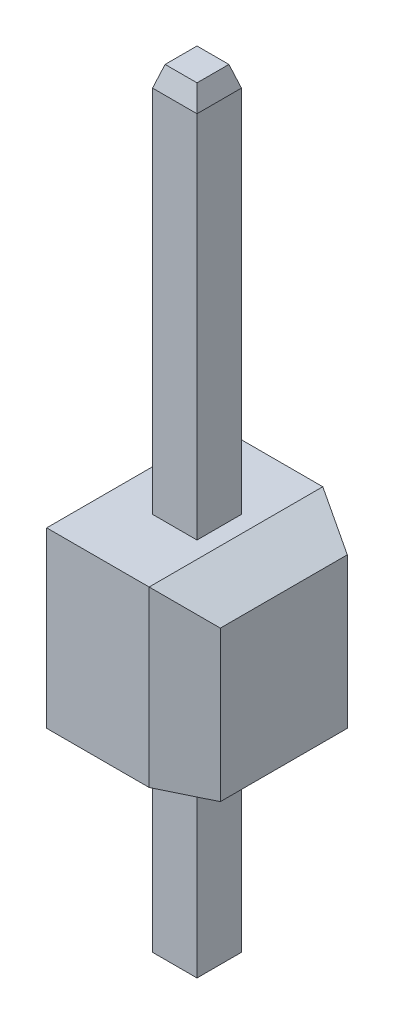
ISO-10303-21;
HEADER;
FILE_DESCRIPTION(('STEP AP214'),'2;1');
FILE_NAME('part.step','',(''),(''),'','','');
FILE_SCHEMA(('AUTOMOTIVE_DESIGN { 1 0 10303 214 1 1 1 1 }'));
ENDSEC;
DATA;
#1=APPLICATION_CONTEXT('core data for automotive mechanical design processes');
#2=APPLICATION_PROTOCOL_DEFINITION('international standard','automotive_design',2000,#1);
#3=PRODUCT_CONTEXT('',#1,'mechanical');
#4=PRODUCT('Part','Part','',(#3));
#5=PRODUCT_RELATED_PRODUCT_CATEGORY('part','',(#4));
#6=PRODUCT_DEFINITION_FORMATION('','',#4);
#7=PRODUCT_DEFINITION_CONTEXT('part definition',#1,'design');
#8=PRODUCT_DEFINITION('design','',#6,#7);
#9=PRODUCT_DEFINITION_SHAPE('','',#8);
#10=(LENGTH_UNIT() NAMED_UNIT(*) SI_UNIT(.MILLI.,.METRE.));
#11=(NAMED_UNIT(*) PLANE_ANGLE_UNIT() SI_UNIT($,.RADIAN.));
#12=(NAMED_UNIT(*) SI_UNIT($,.STERADIAN.) SOLID_ANGLE_UNIT());
#13=UNCERTAINTY_MEASURE_WITH_UNIT(LENGTH_MEASURE(1.E-05),#10,'distance_accuracy_value','');
#14=(GEOMETRIC_REPRESENTATION_CONTEXT(3) GLOBAL_UNCERTAINTY_ASSIGNED_CONTEXT((#13)) GLOBAL_UNIT_ASSIGNED_CONTEXT((#10,
#11,#12)) REPRESENTATION_CONTEXT('',''));
#15=CARTESIAN_POINT('',(0.,0.,0.));
#16=DIRECTION('',(0.,0.,1.));
#17=DIRECTION('',(1.,0.,0.));
#18=AXIS2_PLACEMENT_3D('',#15,#16,#17);
#19=CARTESIAN_POINT('',(-1.27,0.,1.27));
#20=DIRECTION('',(0.,-1.,0.));
#21=DIRECTION('',(0.,0.,-1.));
#22=AXIS2_PLACEMENT_3D('',#19,#20,#21);
#23=PLANE('',#22);
#24=DIRECTION('',(0.,0.,-1.));
#25=VECTOR('',#24,1.);
#26=CARTESIAN_POINT('',(1.27,0.,1.27));
#27=LINE('',#26,#25);
#28=CARTESIAN_POINT('',(1.27,0.,0.928587188003895));
#29=VERTEX_POINT('',#28);
#30=CARTESIAN_POINT('',(1.27,0.,-0.928587188003895));
#31=VERTEX_POINT('',#30);
#32=EDGE_CURVE('E222',#29,#31,#27,.T.);
#33=ORIENTED_EDGE('',*,*,#32,.F.);
#34=DIRECTION('',(0.89879404629917,0.,-0.438371146789072));
#35=VECTOR('',#34,1.);
#36=CARTESIAN_POINT('',(-0.916408557299617,0.,1.99496989331817));
#37=LINE('',#36,#35);
#38=CARTESIAN_POINT('',(0.569999999999985,0.,1.27));
#39=VERTEX_POINT('',#38);
#40=EDGE_CURVE('E308',#29,#39,#37,.F.);
#41=ORIENTED_EDGE('',*,*,#40,.T.);
#42=DIRECTION('',(1.,0.,0.));
#43=VECTOR('',#42,1.);
#44=CARTESIAN_POINT('',(-1.27,0.,1.27));
#45=LINE('',#44,#43);
#46=CARTESIAN_POINT('',(-0.928587188003896,0.,1.27));
#47=VERTEX_POINT('',#46);
#48=EDGE_CURVE('E226',#47,#39,#45,.T.);
#49=ORIENTED_EDGE('',*,*,#48,.F.);
#50=DIRECTION('',(-0.438371146789073,0.,-0.898794046299169));
#51=VECTOR('',#50,1.);
#52=CARTESIAN_POINT('',(-0.994196236237645,0.,1.13548151636398));
#53=LINE('',#52,#51);
#54=CARTESIAN_POINT('',(-1.27,0.,0.569999999999989));
#55=VERTEX_POINT('',#54);
#56=EDGE_CURVE('E304',#47,#55,#53,.T.);
#57=ORIENTED_EDGE('',*,*,#56,.T.);
#58=DIRECTION('',(0.,0.,-1.));
#59=VECTOR('',#58,1.);
#60=CARTESIAN_POINT('',(-1.27,0.,1.27));
#61=LINE('',#60,#59);
#62=CARTESIAN_POINT('',(-1.27,0.,-0.569999999999988));
#63=VERTEX_POINT('',#62);
#64=EDGE_CURVE('E223',#55,#63,#61,.T.);
#65=ORIENTED_EDGE('',*,*,#64,.T.);
#66=DIRECTION('',(0.438371146789073,0.,-0.898794046299169));
#67=VECTOR('',#66,1.);
#68=CARTESIAN_POINT('',(-1.99496989331817,0.,0.916408557299615));
#69=LINE('',#68,#67);
#70=CARTESIAN_POINT('',(-0.928587188003896,0.,-1.27));
#71=VERTEX_POINT('',#70);
#72=EDGE_CURVE('E302',#63,#71,#69,.T.);
#73=ORIENTED_EDGE('',*,*,#72,.T.);
#74=DIRECTION('',(1.,0.,0.));
#75=VECTOR('',#74,1.);
#76=CARTESIAN_POINT('',(-1.27,0.,-1.27));
#77=LINE('',#76,#75);
#78=CARTESIAN_POINT('',(0.569999999999985,0.,-1.27));
#79=VERTEX_POINT('',#78);
#80=EDGE_CURVE('E236',#71,#79,#77,.T.);
#81=ORIENTED_EDGE('',*,*,#80,.T.);
#82=DIRECTION('',(-0.89879404629917,0.,-0.438371146789072));
#83=VECTOR('',#82,1.);
#84=CARTESIAN_POINT('',(0.0843650997809104,0.,-1.50685996698177));
#85=LINE('',#84,#83);
#86=EDGE_CURVE('E306',#79,#31,#85,.F.);
#87=ORIENTED_EDGE('',*,*,#86,.T.);
#88=EDGE_LOOP('',(#33,#41,#49,#57,#65,#73,#81,#87));
#89=FACE_BOUND('',#88,.T.);
#90=DIRECTION('',(0.,0.,1.));
#91=VECTOR('',#90,1.);
#92=CARTESIAN_POINT('',(0.325,0.,0.325));
#93=LINE('',#92,#91);
#94=CARTESIAN_POINT('',(0.325,0.,-0.325));
#95=VERTEX_POINT('',#94);
#96=CARTESIAN_POINT('',(0.325,0.,0.325));
#97=VERTEX_POINT('',#96);
#98=EDGE_CURVE('E173',#95,#97,#93,.T.);
#99=ORIENTED_EDGE('',*,*,#98,.F.);
#100=DIRECTION('',(1.,0.,0.));
#101=VECTOR('',#100,1.);
#102=CARTESIAN_POINT('',(0.325,0.,-0.325));
#103=LINE('',#102,#101);
#104=CARTESIAN_POINT('',(-0.325,0.,-0.325));
#105=VERTEX_POINT('',#104);
#106=EDGE_CURVE('E183',#105,#95,#103,.T.);
#107=ORIENTED_EDGE('',*,*,#106,.F.);
#108=DIRECTION('',(0.,0.,-1.));
#109=VECTOR('',#108,1.);
#110=CARTESIAN_POINT('',(-0.325,0.,-0.325));
#111=LINE('',#110,#109);
#112=CARTESIAN_POINT('',(-0.325,0.,0.325));
#113=VERTEX_POINT('',#112);
#114=EDGE_CURVE('E195',#113,#105,#111,.T.);
#115=ORIENTED_EDGE('',*,*,#114,.F.);
#116=DIRECTION('',(-1.,0.,0.));
#117=VECTOR('',#116,1.);
#118=CARTESIAN_POINT('',(-0.325,0.,0.325));
#119=LINE('',#118,#117);
#120=EDGE_CURVE('E193',#97,#113,#119,.T.);
#121=ORIENTED_EDGE('',*,*,#120,.F.);
#122=EDGE_LOOP('',(#99,#107,#115,#121));
#123=FACE_BOUND('',#122,.T.);
#124=ADVANCED_FACE('F33',(#89,#123),#23,.T.);
#125=CARTESIAN_POINT('',(-1.27,2.54,-1.27));
#126=DIRECTION('',(0.,1.,0.));
#127=DIRECTION('',(0.,0.,1.));
#128=AXIS2_PLACEMENT_3D('',#125,#126,#127);
#129=PLANE('',#128);
#130=DIRECTION('',(1.,0.,0.));
#131=VECTOR('',#130,1.);
#132=CARTESIAN_POINT('',(-1.27,2.54,1.27));
#133=LINE('',#132,#131);
#134=CARTESIAN_POINT('',(-0.928587188003896,2.54,1.27));
#135=VERTEX_POINT('',#134);
#136=CARTESIAN_POINT('',(0.569999999999985,2.54,1.27));
#137=VERTEX_POINT('',#136);
#138=EDGE_CURVE('E229',#135,#137,#133,.T.);
#139=ORIENTED_EDGE('',*,*,#138,.T.);
#140=DIRECTION('',(0.,0.,-1.));
#141=VECTOR('',#140,1.);
#142=CARTESIAN_POINT('',(0.569999999999985,2.54,-1.27));
#143=LINE('',#142,#141);
#144=CARTESIAN_POINT('',(0.569999999999985,2.54,-1.27));
#145=VERTEX_POINT('',#144);
#146=EDGE_CURVE('E321',#137,#145,#143,.T.);
#147=ORIENTED_EDGE('',*,*,#146,.T.);
#148=DIRECTION('',(1.,0.,0.));
#149=VECTOR('',#148,1.);
#150=CARTESIAN_POINT('',(-1.27,2.54,-1.27));
#151=LINE('',#150,#149);
#152=CARTESIAN_POINT('',(-0.928587188003896,2.54,-1.27));
#153=VERTEX_POINT('',#152);
#154=EDGE_CURVE('E233',#153,#145,#151,.T.);
#155=ORIENTED_EDGE('',*,*,#154,.F.);
#156=DIRECTION('',(0.,0.,1.));
#157=VECTOR('',#156,1.);
#158=CARTESIAN_POINT('',(-0.928587188003896,2.54,1.27));
#159=LINE('',#158,#157);
#160=EDGE_CURVE('E319',#153,#135,#159,.T.);
#161=ORIENTED_EDGE('',*,*,#160,.T.);
#162=EDGE_LOOP('',(#139,#147,#155,#161));
#163=FACE_BOUND('',#162,.T.);
#164=DIRECTION('',(-1.,0.,0.));
#165=VECTOR('',#164,1.);
#166=CARTESIAN_POINT('',(-0.325,2.54,-0.325));
#167=LINE('',#166,#165);
#168=CARTESIAN_POINT('',(0.325,2.54,-0.325));
#169=VERTEX_POINT('',#168);
#170=CARTESIAN_POINT('',(-0.325,2.54,-0.325));
#171=VERTEX_POINT('',#170);
#172=EDGE_CURVE('E205',#169,#171,#167,.T.);
#173=ORIENTED_EDGE('',*,*,#172,.F.);
#174=DIRECTION('',(0.,0.,-1.));
#175=VECTOR('',#174,1.);
#176=CARTESIAN_POINT('',(0.325,2.54,-0.325));
#177=LINE('',#176,#175);
#178=CARTESIAN_POINT('',(0.325,2.54,0.325));
#179=VERTEX_POINT('',#178);
#180=EDGE_CURVE('E179',#179,#169,#177,.T.);
#181=ORIENTED_EDGE('',*,*,#180,.F.);
#182=DIRECTION('',(1.,0.,0.));
#183=VECTOR('',#182,1.);
#184=CARTESIAN_POINT('',(0.325,2.54,0.325));
#185=LINE('',#184,#183);
#186=CARTESIAN_POINT('',(-0.325,2.54,0.325));
#187=VERTEX_POINT('',#186);
#188=EDGE_CURVE('E211',#187,#179,#185,.T.);
#189=ORIENTED_EDGE('',*,*,#188,.F.);
#190=DIRECTION('',(0.,0.,1.));
#191=VECTOR('',#190,1.);
#192=CARTESIAN_POINT('',(-0.325,2.54,0.325));
#193=LINE('',#192,#191);
#194=EDGE_CURVE('E208',#171,#187,#193,.T.);
#195=ORIENTED_EDGE('',*,*,#194,.F.);
#196=EDGE_LOOP('',(#173,#181,#189,#195));
#197=FACE_BOUND('',#196,.T.);
#198=ADVANCED_FACE('F355',(#163,#197),#129,.T.);
#199=CARTESIAN_POINT('',(-1.27,2.54,1.27));
#200=DIRECTION('',(0.,0.,1.));
#201=DIRECTION('',(1.,0.,0.));
#202=AXIS2_PLACEMENT_3D('',#199,#200,#201);
#203=PLANE('',#202);
#204=ORIENTED_EDGE('',*,*,#48,.T.);
#205=DIRECTION('',(0.,1.,0.));
#206=VECTOR('',#205,1.);
#207=CARTESIAN_POINT('',(0.569999999999985,2.54,1.27));
#208=LINE('',#207,#206);
#209=EDGE_CURVE('E313',#39,#137,#208,.T.);
#210=ORIENTED_EDGE('',*,*,#209,.T.);
#211=ORIENTED_EDGE('',*,*,#138,.F.);
#212=DIRECTION('',(0.,-1.,0.));
#213=VECTOR('',#212,1.);
#214=CARTESIAN_POINT('',(-0.928587188003896,0.,1.27));
#215=LINE('',#214,#213);
#216=EDGE_CURVE('E310',#135,#47,#215,.T.);
#217=ORIENTED_EDGE('',*,*,#216,.T.);
#218=EDGE_LOOP('',(#204,#210,#211,#217));
#219=FACE_BOUND('',#218,.T.);
#220=ADVANCED_FACE('F351',(#219),#203,.T.);
#221=CARTESIAN_POINT('',(-1.27,0.,-1.27));
#222=DIRECTION('',(0.,0.,-1.));
#223=DIRECTION('',(-1.,0.,0.));
#224=AXIS2_PLACEMENT_3D('',#221,#222,#223);
#225=PLANE('',#224);
#226=ORIENTED_EDGE('',*,*,#154,.T.);
#227=DIRECTION('',(0.,-1.,0.));
#228=VECTOR('',#227,1.);
#229=CARTESIAN_POINT('',(0.569999999999985,0.,-1.27));
#230=LINE('',#229,#228);
#231=EDGE_CURVE('E317',#145,#79,#230,.T.);
#232=ORIENTED_EDGE('',*,*,#231,.T.);
#233=ORIENTED_EDGE('',*,*,#80,.F.);
#234=DIRECTION('',(0.,1.,0.));
#235=VECTOR('',#234,1.);
#236=CARTESIAN_POINT('',(-0.928587188003896,2.54,-1.27));
#237=LINE('',#236,#235);
#238=EDGE_CURVE('E315',#71,#153,#237,.T.);
#239=ORIENTED_EDGE('',*,*,#238,.T.);
#240=EDGE_LOOP('',(#226,#232,#233,#239));
#241=FACE_BOUND('',#240,.T.);
#242=ADVANCED_FACE('F374',(#241),#225,.T.);
#243=CARTESIAN_POINT('',(-1.27,0.,0.));
#244=DIRECTION('',(1.,0.,0.));
#245=DIRECTION('',(0.,0.,-1.));
#246=AXIS2_PLACEMENT_3D('',#243,#244,#245);
#247=PLANE('',#246);
#248=ORIENTED_EDGE('',*,*,#64,.F.);
#249=DIRECTION('',(0.,1.,0.));
#250=VECTOR('',#249,1.);
#251=CARTESIAN_POINT('',(-1.27,2.54,0.569999999999989));
#252=LINE('',#251,#250);
#253=CARTESIAN_POINT('',(-1.27,1.83999999999999,0.569999999999989));
#254=VERTEX_POINT('',#253);
#255=EDGE_CURVE('E11',#55,#254,#252,.T.);
#256=ORIENTED_EDGE('',*,*,#255,.T.);
#257=DIRECTION('',(0.,0.,-1.));
#258=VECTOR('',#257,1.);
#259=CARTESIAN_POINT('',(-1.27,1.83999999999999,-1.27));
#260=LINE('',#259,#258);
#261=CARTESIAN_POINT('',(-1.27,1.83999999999999,-0.569999999999989));
#262=VERTEX_POINT('',#261);
#263=EDGE_CURVE('E42',#254,#262,#260,.T.);
#264=ORIENTED_EDGE('',*,*,#263,.T.);
#265=DIRECTION('',(0.,-1.,0.));
#266=VECTOR('',#265,1.);
#267=CARTESIAN_POINT('',(-1.27,0.,-0.569999999999989));
#268=LINE('',#267,#266);
#269=EDGE_CURVE('E323',#262,#63,#268,.T.);
#270=ORIENTED_EDGE('',*,*,#269,.T.);
#271=EDGE_LOOP('',(#248,#256,#264,#270));
#272=FACE_BOUND('',#271,.T.);
#273=ADVANCED_FACE('F343',(#272),#247,.F.);
#274=CARTESIAN_POINT('',(1.27,0.,0.));
#275=DIRECTION('',(1.,0.,0.));
#276=DIRECTION('',(0.,0.,-1.));
#277=AXIS2_PLACEMENT_3D('',#274,#275,#276);
#278=PLANE('',#277);
#279=DIRECTION('',(0.,0.,1.));
#280=VECTOR('',#279,1.);
#281=CARTESIAN_POINT('',(1.27,2.19858718800389,0.));
#282=LINE('',#281,#280);
#283=CARTESIAN_POINT('',(1.27,2.19858718800389,-0.928587188003895));
#284=VERTEX_POINT('',#283);
#285=CARTESIAN_POINT('',(1.27,2.19858718800389,0.928587188003895));
#286=VERTEX_POINT('',#285);
#287=EDGE_CURVE('E285',#284,#286,#282,.T.);
#288=ORIENTED_EDGE('',*,*,#287,.T.);
#289=DIRECTION('',(0.,-1.,0.));
#290=VECTOR('',#289,1.);
#291=CARTESIAN_POINT('',(1.27,0.,0.928587188003895));
#292=LINE('',#291,#290);
#293=EDGE_CURVE('E299',#286,#29,#292,.T.);
#294=ORIENTED_EDGE('',*,*,#293,.T.);
#295=ORIENTED_EDGE('',*,*,#32,.T.);
#296=DIRECTION('',(0.,1.,0.));
#297=VECTOR('',#296,1.);
#298=CARTESIAN_POINT('',(1.27,0.,-0.928587188003895));
#299=LINE('',#298,#297);
#300=EDGE_CURVE('E297',#31,#284,#299,.T.);
#301=ORIENTED_EDGE('',*,*,#300,.T.);
#302=EDGE_LOOP('',(#288,#294,#295,#301));
#303=FACE_BOUND('',#302,.T.);
#304=ADVANCED_FACE('F367',(#303),#278,.T.);
#305=CARTESIAN_POINT('',(0.325,8.24,-0.325));
#306=DIRECTION('',(-1.,0.,0.));
#307=DIRECTION('',(0.,0.,1.));
#308=AXIS2_PLACEMENT_3D('',#305,#306,#307);
#309=PLANE('',#308);
#310=DIRECTION('',(0.,-1.,0.));
#311=VECTOR('',#310,1.);
#312=CARTESIAN_POINT('',(0.325,8.24,-0.325));
#313=LINE('',#312,#311);
#314=CARTESIAN_POINT('',(0.325,7.94,-0.325));
#315=VERTEX_POINT('',#314);
#316=EDGE_CURVE('E220',#315,#169,#313,.T.);
#317=ORIENTED_EDGE('',*,*,#316,.F.);
#318=DIRECTION('',(0.,0.,1.));
#319=VECTOR('',#318,1.);
#320=CARTESIAN_POINT('',(0.325,7.94,-0.325));
#321=LINE('',#320,#319);
#322=CARTESIAN_POINT('',(0.325,7.94,0.325));
#323=VERTEX_POINT('',#322);
#324=EDGE_CURVE('E256',#315,#323,#321,.T.);
#325=ORIENTED_EDGE('',*,*,#324,.T.);
#326=DIRECTION('',(0.,-1.,0.));
#327=VECTOR('',#326,1.);
#328=CARTESIAN_POINT('',(0.325,8.24,0.325));
#329=LINE('',#328,#327);
#330=EDGE_CURVE('E214',#323,#179,#329,.T.);
#331=ORIENTED_EDGE('',*,*,#330,.T.);
#332=ORIENTED_EDGE('',*,*,#180,.T.);
#333=EDGE_LOOP('',(#317,#325,#331,#332));
#334=FACE_BOUND('',#333,.T.);
#335=ADVANCED_FACE('F547',(#334),#309,.F.);
#336=CARTESIAN_POINT('',(-0.325,8.24,-0.325));
#337=DIRECTION('',(0.,0.,1.));
#338=DIRECTION('',(1.,0.,0.));
#339=AXIS2_PLACEMENT_3D('',#336,#337,#338);
#340=PLANE('',#339);
#341=DIRECTION('',(0.,-1.,0.));
#342=VECTOR('',#341,1.);
#343=CARTESIAN_POINT('',(-0.325,8.24,-0.325));
#344=LINE('',#343,#342);
#345=CARTESIAN_POINT('',(-0.325,7.94,-0.325));
#346=VERTEX_POINT('',#345);
#347=EDGE_CURVE('E218',#346,#171,#344,.T.);
#348=ORIENTED_EDGE('',*,*,#347,.F.);
#349=DIRECTION('',(1.,0.,0.));
#350=VECTOR('',#349,1.);
#351=CARTESIAN_POINT('',(-0.325,7.94,-0.325));
#352=LINE('',#351,#350);
#353=EDGE_CURVE('E254',#346,#315,#352,.T.);
#354=ORIENTED_EDGE('',*,*,#353,.T.);
#355=ORIENTED_EDGE('',*,*,#316,.T.);
#356=ORIENTED_EDGE('',*,*,#172,.T.);
#357=EDGE_LOOP('',(#348,#354,#355,#356));
#358=FACE_BOUND('',#357,.T.);
#359=ADVANCED_FACE('F539',(#358),#340,.F.);
#360=CARTESIAN_POINT('',(-0.325,8.24,0.325));
#361=DIRECTION('',(1.,0.,0.));
#362=DIRECTION('',(0.,0.,-1.));
#363=AXIS2_PLACEMENT_3D('',#360,#361,#362);
#364=PLANE('',#363);
#365=DIRECTION('',(0.,-1.,0.));
#366=VECTOR('',#365,1.);
#367=CARTESIAN_POINT('',(-0.325,8.24,0.325));
#368=LINE('',#367,#366);
#369=CARTESIAN_POINT('',(-0.325,7.94,0.325));
#370=VERTEX_POINT('',#369);
#371=EDGE_CURVE('E216',#370,#187,#368,.T.);
#372=ORIENTED_EDGE('',*,*,#371,.F.);
#373=DIRECTION('',(0.,0.,-1.));
#374=VECTOR('',#373,1.);
#375=CARTESIAN_POINT('',(-0.325,7.94,0.325));
#376=LINE('',#375,#374);
#377=EDGE_CURVE('E249',#370,#346,#376,.T.);
#378=ORIENTED_EDGE('',*,*,#377,.T.);
#379=ORIENTED_EDGE('',*,*,#347,.T.);
#380=ORIENTED_EDGE('',*,*,#194,.T.);
#381=EDGE_LOOP('',(#372,#378,#379,#380));
#382=FACE_BOUND('',#381,.T.);
#383=ADVANCED_FACE('F531',(#382),#364,.F.);
#384=CARTESIAN_POINT('',(0.325,8.24,0.325));
#385=DIRECTION('',(0.,0.,-1.));
#386=DIRECTION('',(-1.,0.,0.));
#387=AXIS2_PLACEMENT_3D('',#384,#385,#386);
#388=PLANE('',#387);
#389=ORIENTED_EDGE('',*,*,#330,.F.);
#390=DIRECTION('',(-1.,0.,0.));
#391=VECTOR('',#390,1.);
#392=CARTESIAN_POINT('',(0.325,7.94,0.325));
#393=LINE('',#392,#391);
#394=EDGE_CURVE('E252',#323,#370,#393,.T.);
#395=ORIENTED_EDGE('',*,*,#394,.T.);
#396=ORIENTED_EDGE('',*,*,#371,.T.);
#397=ORIENTED_EDGE('',*,*,#188,.T.);
#398=EDGE_LOOP('',(#389,#395,#396,#397));
#399=FACE_BOUND('',#398,.T.);
#400=ADVANCED_FACE('F523',(#399),#388,.F.);
#401=CARTESIAN_POINT('',(0.,8.24,0.));
#402=DIRECTION('',(0.,-1.,0.));
#403=DIRECTION('',(0.,0.,-1.));
#404=AXIS2_PLACEMENT_3D('',#401,#402,#403);
#405=PLANE('',#404);
#406=DIRECTION('',(-1.,0.,0.));
#407=VECTOR('',#406,1.);
#408=CARTESIAN_POINT('',(0.,8.24,-0.233280795562402));
#409=LINE('',#408,#407);
#410=CARTESIAN_POINT('',(0.233280795562402,8.24,-0.233280795562402));
#411=VERTEX_POINT('',#410);
#412=CARTESIAN_POINT('',(-0.233280795562402,8.24,-0.233280795562401));
#413=VERTEX_POINT('',#412);
#414=EDGE_CURVE('E242',#411,#413,#409,.T.);
#415=ORIENTED_EDGE('',*,*,#414,.T.);
#416=DIRECTION('',(0.,0.,1.));
#417=VECTOR('',#416,1.);
#418=CARTESIAN_POINT('',(-0.233280795562402,8.24,0.));
#419=LINE('',#418,#417);
#420=CARTESIAN_POINT('',(-0.233280795562402,8.24,0.233280795562402));
#421=VERTEX_POINT('',#420);
#422=EDGE_CURVE('E246',#413,#421,#419,.T.);
#423=ORIENTED_EDGE('',*,*,#422,.T.);
#424=DIRECTION('',(1.,0.,0.));
#425=VECTOR('',#424,1.);
#426=CARTESIAN_POINT('',(0.,8.24,0.233280795562402));
#427=LINE('',#426,#425);
#428=CARTESIAN_POINT('',(0.233280795562402,8.24,0.233280795562402));
#429=VERTEX_POINT('',#428);
#430=EDGE_CURVE('E244',#421,#429,#427,.T.);
#431=ORIENTED_EDGE('',*,*,#430,.T.);
#432=DIRECTION('',(0.,0.,-1.));
#433=VECTOR('',#432,1.);
#434=CARTESIAN_POINT('',(0.233280795562402,8.24,0.));
#435=LINE('',#434,#433);
#436=EDGE_CURVE('E232',#429,#411,#435,.T.);
#437=ORIENTED_EDGE('',*,*,#436,.T.);
#438=EDGE_LOOP('',(#415,#423,#431,#437));
#439=FACE_BOUND('',#438,.T.);
#440=ADVANCED_FACE('F517',(#439),#405,.F.);
#441=CARTESIAN_POINT('',(0.325,-3.1,-0.325));
#442=DIRECTION('',(0.,0.,1.));
#443=DIRECTION('',(1.,0.,0.));
#444=AXIS2_PLACEMENT_3D('',#441,#442,#443);
#445=PLANE('',#444);
#446=DIRECTION('',(0.,1.,0.));
#447=VECTOR('',#446,1.);
#448=CARTESIAN_POINT('',(0.325,-3.1,-0.325));
#449=LINE('',#448,#447);
#450=CARTESIAN_POINT('',(0.325,-3.0082807955624,-0.325));
#451=VERTEX_POINT('',#450);
#452=EDGE_CURVE('E168',#451,#95,#449,.T.);
#453=ORIENTED_EDGE('',*,*,#452,.F.);
#454=DIRECTION('',(-1.,0.,0.));
#455=VECTOR('',#454,1.);
#456=CARTESIAN_POINT('',(0.325,-3.0082807955624,-0.325));
#457=LINE('',#456,#455);
#458=CARTESIAN_POINT('',(-0.325,-3.0082807955624,-0.325));
#459=VERTEX_POINT('',#458);
#460=EDGE_CURVE('E283',#451,#459,#457,.T.);
#461=ORIENTED_EDGE('',*,*,#460,.T.);
#462=DIRECTION('',(0.,1.,0.));
#463=VECTOR('',#462,1.);
#464=CARTESIAN_POINT('',(-0.325,-3.1,-0.325));
#465=LINE('',#464,#463);
#466=EDGE_CURVE('E186',#459,#105,#465,.T.);
#467=ORIENTED_EDGE('',*,*,#466,.T.);
#468=ORIENTED_EDGE('',*,*,#106,.T.);
#469=EDGE_LOOP('',(#453,#461,#467,#468));
#470=FACE_BOUND('',#469,.T.);
#471=ADVANCED_FACE('F184',(#470),#445,.F.);
#472=CARTESIAN_POINT('',(0.325,-3.1,0.325));
#473=DIRECTION('',(-1.,0.,0.));
#474=DIRECTION('',(0.,0.,1.));
#475=AXIS2_PLACEMENT_3D('',#472,#473,#474);
#476=PLANE('',#475);
#477=DIRECTION('',(0.,1.,0.));
#478=VECTOR('',#477,1.);
#479=CARTESIAN_POINT('',(0.325,-3.1,0.325));
#480=LINE('',#479,#478);
#481=CARTESIAN_POINT('',(0.325,-3.0082807955624,0.325));
#482=VERTEX_POINT('',#481);
#483=EDGE_CURVE('E180',#482,#97,#480,.T.);
#484=ORIENTED_EDGE('',*,*,#483,.F.);
#485=DIRECTION('',(0.,0.,-1.));
#486=VECTOR('',#485,1.);
#487=CARTESIAN_POINT('',(0.325,-3.0082807955624,0.325));
#488=LINE('',#487,#486);
#489=EDGE_CURVE('E176',#482,#451,#488,.T.);
#490=ORIENTED_EDGE('',*,*,#489,.T.);
#491=ORIENTED_EDGE('',*,*,#452,.T.);
#492=ORIENTED_EDGE('',*,*,#98,.T.);
#493=EDGE_LOOP('',(#484,#490,#491,#492));
#494=FACE_BOUND('',#493,.T.);
#495=ADVANCED_FACE('F171',(#494),#476,.F.);
#496=CARTESIAN_POINT('',(-0.325,-3.1,0.325));
#497=DIRECTION('',(0.,0.,-1.));
#498=DIRECTION('',(-1.,0.,0.));
#499=AXIS2_PLACEMENT_3D('',#496,#497,#498);
#500=PLANE('',#499);
#501=DIRECTION('',(0.,1.,0.));
#502=VECTOR('',#501,1.);
#503=CARTESIAN_POINT('',(-0.325,-3.1,0.325));
#504=LINE('',#503,#502);
#505=CARTESIAN_POINT('',(-0.325,-3.0082807955624,0.325));
#506=VERTEX_POINT('',#505);
#507=EDGE_CURVE('E200',#506,#113,#504,.T.);
#508=ORIENTED_EDGE('',*,*,#507,.F.);
#509=DIRECTION('',(1.,0.,0.));
#510=VECTOR('',#509,1.);
#511=CARTESIAN_POINT('',(-0.325,-3.0082807955624,0.325));
#512=LINE('',#511,#510);
#513=EDGE_CURVE('E277',#506,#482,#512,.T.);
#514=ORIENTED_EDGE('',*,*,#513,.T.);
#515=ORIENTED_EDGE('',*,*,#483,.T.);
#516=ORIENTED_EDGE('',*,*,#120,.T.);
#517=EDGE_LOOP('',(#508,#514,#515,#516));
#518=FACE_BOUND('',#517,.T.);
#519=ADVANCED_FACE('F497',(#518),#500,.F.);
#520=CARTESIAN_POINT('',(-0.325,-3.1,-0.325));
#521=DIRECTION('',(1.,0.,0.));
#522=DIRECTION('',(0.,0.,-1.));
#523=AXIS2_PLACEMENT_3D('',#520,#521,#522);
#524=PLANE('',#523);
#525=ORIENTED_EDGE('',*,*,#466,.F.);
#526=DIRECTION('',(0.,0.,1.));
#527=VECTOR('',#526,1.);
#528=CARTESIAN_POINT('',(-0.325,-3.0082807955624,-0.325));
#529=LINE('',#528,#527);
#530=EDGE_CURVE('E280',#459,#506,#529,.T.);
#531=ORIENTED_EDGE('',*,*,#530,.T.);
#532=ORIENTED_EDGE('',*,*,#507,.T.);
#533=ORIENTED_EDGE('',*,*,#114,.T.);
#534=EDGE_LOOP('',(#525,#531,#532,#533));
#535=FACE_BOUND('',#534,.T.);
#536=ADVANCED_FACE('F489',(#535),#524,.F.);
#537=CARTESIAN_POINT('',(0.,-3.1,0.));
#538=DIRECTION('',(0.,1.,0.));
#539=DIRECTION('',(0.,0.,1.));
#540=AXIS2_PLACEMENT_3D('',#537,#538,#539);
#541=PLANE('',#540);
#542=DIRECTION('',(0.,0.,1.));
#543=VECTOR('',#542,1.);
#544=CARTESIAN_POINT('',(0.0249999999999932,-3.1,0.));
#545=LINE('',#544,#543);
#546=CARTESIAN_POINT('',(0.0249999999999932,-3.1,-0.0249999999999931));
#547=VERTEX_POINT('',#546);
#548=CARTESIAN_POINT('',(0.0249999999999932,-3.1,0.0249999999999932));
#549=VERTEX_POINT('',#548);
#550=EDGE_CURVE('E270',#547,#549,#545,.T.);
#551=ORIENTED_EDGE('',*,*,#550,.T.);
#552=DIRECTION('',(-1.,0.,0.));
#553=VECTOR('',#552,1.);
#554=CARTESIAN_POINT('',(0.,-3.1,0.0249999999999932));
#555=LINE('',#554,#553);
#556=CARTESIAN_POINT('',(-0.0249999999999931,-3.1,0.0249999999999932));
#557=VERTEX_POINT('',#556);
#558=EDGE_CURVE('E274',#549,#557,#555,.T.);
#559=ORIENTED_EDGE('',*,*,#558,.T.);
#560=DIRECTION('',(0.,0.,-1.));
#561=VECTOR('',#560,1.);
#562=CARTESIAN_POINT('',(-0.0249999999999932,-3.1,0.));
#563=LINE('',#562,#561);
#564=CARTESIAN_POINT('',(-0.0249999999999932,-3.1,-0.0249999999999931));
#565=VERTEX_POINT('',#564);
#566=EDGE_CURVE('E272',#557,#565,#563,.T.);
#567=ORIENTED_EDGE('',*,*,#566,.T.);
#568=DIRECTION('',(1.,0.,0.));
#569=VECTOR('',#568,1.);
#570=CARTESIAN_POINT('',(0.,-3.1,-0.0249999999999931));
#571=LINE('',#570,#569);
#572=EDGE_CURVE('E258',#565,#547,#571,.T.);
#573=ORIENTED_EDGE('',*,*,#572,.T.);
#574=EDGE_LOOP('',(#551,#559,#567,#573));
#575=FACE_BOUND('',#574,.T.);
#576=ADVANCED_FACE('F406',(#575),#541,.F.);
#577=CARTESIAN_POINT('',(0.233280795562402,8.24,0.));
#578=DIRECTION('',(-0.956304755963036,-0.292371704722735,0.));
#579=DIRECTION('',(0.,0.,-1.));
#580=AXIS2_PLACEMENT_3D('',#577,#578,#579);
#581=PLANE('',#580);
#582=DIRECTION('',(0.280623595142126,-0.917878420979062,0.280623595142126));
#583=VECTOR('',#582,1.);
#584=CARTESIAN_POINT('',(0.214910025722512,8.30008808063437,0.214910025722512));
#585=LINE('',#584,#583);
#586=EDGE_CURVE('E264',#323,#429,#585,.F.);
#587=ORIENTED_EDGE('',*,*,#586,.F.);
#588=ORIENTED_EDGE('',*,*,#324,.F.);
#589=DIRECTION('',(-0.280623595142126,0.917878420979062,0.280623595142126));
#590=VECTOR('',#589,1.);
#591=CARTESIAN_POINT('',(0.214910025722512,8.30008808063437,-0.214910025722512));
#592=LINE('',#591,#590);
#593=EDGE_CURVE('E190',#411,#315,#592,.F.);
#594=ORIENTED_EDGE('',*,*,#593,.F.);
#595=ORIENTED_EDGE('',*,*,#436,.F.);
#596=EDGE_LOOP('',(#587,#588,#594,#595));
#597=FACE_BOUND('',#596,.T.);
#598=ADVANCED_FACE('F402',(#597),#581,.F.);
#599=CARTESIAN_POINT('',(0.,8.24,-0.233280795562402));
#600=DIRECTION('',(0.,-0.292371704722735,0.956304755963036));
#601=DIRECTION('',(-1.,0.,0.));
#602=AXIS2_PLACEMENT_3D('',#599,#600,#601);
#603=PLANE('',#602);
#604=ORIENTED_EDGE('',*,*,#593,.T.);
#605=ORIENTED_EDGE('',*,*,#353,.F.);
#606=DIRECTION('',(0.280623595142126,0.917878420979062,0.280623595142126));
#607=VECTOR('',#606,1.);
#608=CARTESIAN_POINT('',(-0.214910025722512,8.30008808063437,-0.214910025722512));
#609=LINE('',#608,#607);
#610=EDGE_CURVE('E261',#413,#346,#609,.F.);
#611=ORIENTED_EDGE('',*,*,#610,.F.);
#612=ORIENTED_EDGE('',*,*,#414,.F.);
#613=EDGE_LOOP('',(#604,#605,#611,#612));
#614=FACE_BOUND('',#613,.T.);
#615=ADVANCED_FACE('F398',(#614),#603,.F.);
#616=CARTESIAN_POINT('',(0.,8.24,0.233280795562402));
#617=DIRECTION('',(0.,-0.292371704722735,-0.956304755963036));
#618=DIRECTION('',(1.,0.,0.));
#619=AXIS2_PLACEMENT_3D('',#616,#617,#618);
#620=PLANE('',#619);
#621=ORIENTED_EDGE('',*,*,#586,.T.);
#622=ORIENTED_EDGE('',*,*,#430,.F.);
#623=DIRECTION('',(-0.280623595142126,-0.917878420979062,0.280623595142126));
#624=VECTOR('',#623,1.);
#625=CARTESIAN_POINT('',(-0.214910025722512,8.30008808063437,0.214910025722512));
#626=LINE('',#625,#624);
#627=EDGE_CURVE('E259',#370,#421,#626,.F.);
#628=ORIENTED_EDGE('',*,*,#627,.F.);
#629=ORIENTED_EDGE('',*,*,#394,.F.);
#630=EDGE_LOOP('',(#621,#622,#628,#629));
#631=FACE_BOUND('',#630,.T.);
#632=ADVANCED_FACE('F394',(#631),#620,.F.);
#633=CARTESIAN_POINT('',(-0.233280795562402,8.24,0.));
#634=DIRECTION('',(0.956304755963036,-0.292371704722735,0.));
#635=DIRECTION('',(0.,0.,1.));
#636=AXIS2_PLACEMENT_3D('',#633,#634,#635);
#637=PLANE('',#636);
#638=ORIENTED_EDGE('',*,*,#610,.T.);
#639=ORIENTED_EDGE('',*,*,#377,.F.);
#640=ORIENTED_EDGE('',*,*,#627,.T.);
#641=ORIENTED_EDGE('',*,*,#422,.F.);
#642=EDGE_LOOP('',(#638,#639,#640,#641));
#643=FACE_BOUND('',#642,.T.);
#644=ADVANCED_FACE('F390',(#643),#637,.F.);
#645=CARTESIAN_POINT('',(0.,-3.1,-0.0249999999999931));
#646=DIRECTION('',(0.,0.956304755963037,0.29237170472273));
#647=DIRECTION('',(1.,0.,0.));
#648=AXIS2_PLACEMENT_3D('',#645,#646,#647);
#649=PLANE('',#648);
#650=DIRECTION('',(-0.691140749344681,0.211302932280993,-0.691140749344681));
#651=VECTOR('',#650,1.);
#652=CARTESIAN_POINT('',(-0.0130581116148783,-3.10365100167388,-0.0130581116148782));
#653=LINE('',#652,#651);
#654=EDGE_CURVE('E291',#459,#565,#653,.F.);
#655=ORIENTED_EDGE('',*,*,#654,.F.);
#656=ORIENTED_EDGE('',*,*,#460,.F.);
#657=DIRECTION('',(-0.691140749344681,-0.211302932280993,0.691140749344681));
#658=VECTOR('',#657,1.);
#659=CARTESIAN_POINT('',(0.0130581116148783,-3.10365100167388,-0.0130581116148782));
#660=LINE('',#659,#658);
#661=EDGE_CURVE('E262',#547,#451,#660,.F.);
#662=ORIENTED_EDGE('',*,*,#661,.F.);
#663=ORIENTED_EDGE('',*,*,#572,.F.);
#664=EDGE_LOOP('',(#655,#656,#662,#663));
#665=FACE_BOUND('',#664,.T.);
#666=ADVANCED_FACE('F393',(#665),#649,.F.);
#667=CARTESIAN_POINT('',(0.0249999999999932,-3.1,0.));
#668=DIRECTION('',(-0.29237170472273,0.956304755963037,0.));
#669=DIRECTION('',(0.,0.,1.));
#670=AXIS2_PLACEMENT_3D('',#667,#668,#669);
#671=PLANE('',#670);
#672=ORIENTED_EDGE('',*,*,#661,.T.);
#673=ORIENTED_EDGE('',*,*,#489,.F.);
#674=DIRECTION('',(-0.691140749344681,-0.211302932280993,-0.691140749344681));
#675=VECTOR('',#674,1.);
#676=CARTESIAN_POINT('',(0.0130581116148783,-3.10365100167388,0.0130581116148783));
#677=LINE('',#676,#675);
#678=EDGE_CURVE('E288',#549,#482,#677,.F.);
#679=ORIENTED_EDGE('',*,*,#678,.F.);
#680=ORIENTED_EDGE('',*,*,#550,.F.);
#681=EDGE_LOOP('',(#672,#673,#679,#680));
#682=FACE_BOUND('',#681,.T.);
#683=ADVANCED_FACE('F415',(#682),#671,.F.);
#684=CARTESIAN_POINT('',(-0.0249999999999932,-3.1,0.));
#685=DIRECTION('',(0.29237170472273,0.956304755963037,0.));
#686=DIRECTION('',(0.,0.,-1.));
#687=AXIS2_PLACEMENT_3D('',#684,#685,#686);
#688=PLANE('',#687);
#689=ORIENTED_EDGE('',*,*,#654,.T.);
#690=ORIENTED_EDGE('',*,*,#566,.F.);
#691=DIRECTION('',(-0.691140749344681,0.211302932280993,0.691140749344681));
#692=VECTOR('',#691,1.);
#693=CARTESIAN_POINT('',(-0.0130581116148782,-3.10365100167388,0.0130581116148783));
#694=LINE('',#693,#692);
#695=EDGE_CURVE('E286',#506,#557,#694,.F.);
#696=ORIENTED_EDGE('',*,*,#695,.F.);
#697=ORIENTED_EDGE('',*,*,#530,.F.);
#698=EDGE_LOOP('',(#689,#690,#696,#697));
#699=FACE_BOUND('',#698,.T.);
#700=ADVANCED_FACE('F411',(#699),#688,.F.);
#701=CARTESIAN_POINT('',(0.,-3.1,0.0249999999999932));
#702=DIRECTION('',(0.,0.956304755963037,-0.29237170472273));
#703=DIRECTION('',(-1.,0.,0.));
#704=AXIS2_PLACEMENT_3D('',#701,#702,#703);
#705=PLANE('',#704);
#706=ORIENTED_EDGE('',*,*,#678,.T.);
#707=ORIENTED_EDGE('',*,*,#513,.F.);
#708=ORIENTED_EDGE('',*,*,#695,.T.);
#709=ORIENTED_EDGE('',*,*,#558,.F.);
#710=EDGE_LOOP('',(#706,#707,#708,#709));
#711=FACE_BOUND('',#710,.T.);
#712=ADVANCED_FACE('F408',(#711),#705,.F.);
#713=CARTESIAN_POINT('',(1.27,0.,-0.928587188003895));
#714=DIRECTION('',(-0.438371146789072,0.,0.89879404629917));
#715=DIRECTION('',(0.,1.,0.));
#716=AXIS2_PLACEMENT_3D('',#713,#714,#715);
#717=PLANE('',#716);
#718=ORIENTED_EDGE('',*,*,#86,.F.);
#719=ORIENTED_EDGE('',*,*,#231,.F.);
#720=DIRECTION('',(-0.823173207853046,0.401488399504224,-0.401488399504224));
#721=VECTOR('',#720,1.);
#722=CARTESIAN_POINT('',(1.57689295258878,2.04890549382515,-0.77890549382515));
#723=LINE('',#722,#721);
#724=EDGE_CURVE('E289',#284,#145,#723,.T.);
#725=ORIENTED_EDGE('',*,*,#724,.F.);
#726=ORIENTED_EDGE('',*,*,#300,.F.);
#727=EDGE_LOOP('',(#718,#719,#725,#726));
#728=FACE_BOUND('',#727,.T.);
#729=ADVANCED_FACE('F372',(#728),#717,.F.);
#730=CARTESIAN_POINT('',(1.27,2.19858718800389,0.));
#731=DIRECTION('',(-0.438371146789072,-0.89879404629917,0.));
#732=DIRECTION('',(0.,0.,1.));
#733=AXIS2_PLACEMENT_3D('',#730,#731,#732);
#734=PLANE('',#733);
#735=ORIENTED_EDGE('',*,*,#724,.T.);
#736=ORIENTED_EDGE('',*,*,#146,.F.);
#737=DIRECTION('',(0.823173207853046,-0.401488399504224,-0.401488399504224));
#738=VECTOR('',#737,1.);
#739=CARTESIAN_POINT('',(1.57689295258878,2.04890549382515,0.77890549382515));
#740=LINE('',#739,#738);
#741=EDGE_CURVE('E326',#286,#137,#740,.F.);
#742=ORIENTED_EDGE('',*,*,#741,.F.);
#743=ORIENTED_EDGE('',*,*,#287,.F.);
#744=EDGE_LOOP('',(#735,#736,#742,#743));
#745=FACE_BOUND('',#744,.T.);
#746=ADVANCED_FACE('F360',(#745),#734,.F.);
#747=CARTESIAN_POINT('',(1.27,0.,0.928587188003895));
#748=DIRECTION('',(-0.438371146789072,0.,-0.89879404629917));
#749=DIRECTION('',(0.,-1.,0.));
#750=AXIS2_PLACEMENT_3D('',#747,#748,#749);
#751=PLANE('',#750);
#752=ORIENTED_EDGE('',*,*,#741,.T.);
#753=ORIENTED_EDGE('',*,*,#209,.F.);
#754=ORIENTED_EDGE('',*,*,#40,.F.);
#755=ORIENTED_EDGE('',*,*,#293,.F.);
#756=EDGE_LOOP('',(#752,#753,#754,#755));
#757=FACE_BOUND('',#756,.T.);
#758=ADVANCED_FACE('F365',(#757),#751,.F.);
#759=CARTESIAN_POINT('',(-0.928587188003896,0.,-1.27));
#760=DIRECTION('',(-0.898794046299169,0.,-0.438371146789073));
#761=DIRECTION('',(0.,-1.,0.));
#762=AXIS2_PLACEMENT_3D('',#759,#760,#761);
#763=PLANE('',#762);
#764=ORIENTED_EDGE('',*,*,#72,.F.);
#765=ORIENTED_EDGE('',*,*,#269,.F.);
#766=DIRECTION('',(0.326034139782522,0.668469049282116,-0.668469049282116));
#767=VECTOR('',#766,1.);
#768=CARTESIAN_POINT('',(-1.48216426589689,1.40499879058574,-0.134998790585736));
#769=LINE('',#768,#767);
#770=EDGE_CURVE('E37',#153,#262,#769,.F.);
#771=ORIENTED_EDGE('',*,*,#770,.F.);
#772=ORIENTED_EDGE('',*,*,#238,.F.);
#773=EDGE_LOOP('',(#764,#765,#771,#772));
#774=FACE_BOUND('',#773,.T.);
#775=ADVANCED_FACE('F35',(#774),#763,.T.);
#776=CARTESIAN_POINT('',(-0.928587188003896,2.54,-1.27));
#777=DIRECTION('',(-0.898794046299169,0.438371146789073,0.));
#778=DIRECTION('',(0.,0.,-1.));
#779=AXIS2_PLACEMENT_3D('',#776,#777,#778);
#780=PLANE('',#779);
#781=ORIENTED_EDGE('',*,*,#770,.T.);
#782=ORIENTED_EDGE('',*,*,#263,.F.);
#783=DIRECTION('',(0.326034139782522,0.668469049282116,0.668469049282116));
#784=VECTOR('',#783,1.);
#785=CARTESIAN_POINT('',(-1.48216426589689,1.40499879058574,0.134998790585737));
#786=LINE('',#785,#784);
#787=EDGE_CURVE('E330',#135,#254,#786,.F.);
#788=ORIENTED_EDGE('',*,*,#787,.F.);
#789=ORIENTED_EDGE('',*,*,#160,.F.);
#790=EDGE_LOOP('',(#781,#782,#788,#789));
#791=FACE_BOUND('',#790,.T.);
#792=ADVANCED_FACE('F339',(#791),#780,.T.);
#793=CARTESIAN_POINT('',(-0.928587188003896,2.54,1.27));
#794=DIRECTION('',(-0.898794046299169,0.,0.438371146789073));
#795=DIRECTION('',(0.,1.,0.));
#796=AXIS2_PLACEMENT_3D('',#793,#794,#795);
#797=PLANE('',#796);
#798=ORIENTED_EDGE('',*,*,#787,.T.);
#799=ORIENTED_EDGE('',*,*,#255,.F.);
#800=ORIENTED_EDGE('',*,*,#56,.F.);
#801=ORIENTED_EDGE('',*,*,#216,.F.);
#802=EDGE_LOOP('',(#798,#799,#800,#801));
#803=FACE_BOUND('',#802,.T.);
#804=ADVANCED_FACE('F348',(#803),#797,.T.);
#805=CLOSED_SHELL('',(#124,#198,#220,#242,#273,#304,#335,#359,#383,#400,#440,#471,#495,#519,
#536,#576,#598,#615,#632,#644,#666,#683,#700,#712,#729,#746,#758,#775,#792,#804));
#806=MANIFOLD_SOLID_BREP('B2',#805);
#807=ADVANCED_BREP_SHAPE_REPRESENTATION('',(#18,#806),#14);
#808=SHAPE_DEFINITION_REPRESENTATION(#9,#807);
ENDSEC;
END-ISO-10303-21;
